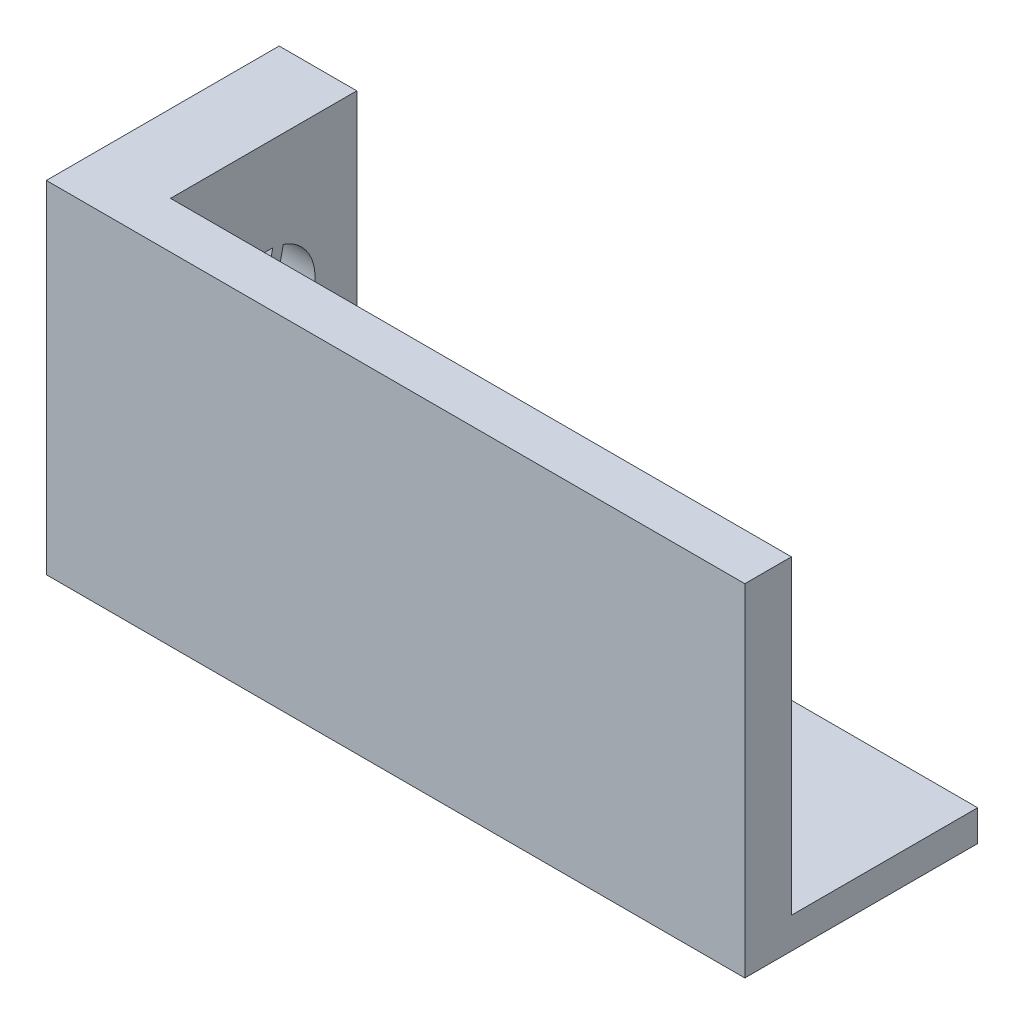
ISO-10303-21;
HEADER;
FILE_DESCRIPTION(('STEP AP214'),'2;1');
FILE_NAME('part.step','',(''),(''),'','','');
FILE_SCHEMA(('AUTOMOTIVE_DESIGN { 1 0 10303 214 1 1 1 1 }'));
ENDSEC;
DATA;
#1=APPLICATION_CONTEXT('core data for automotive mechanical design processes');
#2=APPLICATION_PROTOCOL_DEFINITION('international standard','automotive_design',2000,#1);
#3=PRODUCT_CONTEXT('',#1,'mechanical');
#4=PRODUCT('Part','Part','',(#3));
#5=PRODUCT_RELATED_PRODUCT_CATEGORY('part','',(#4));
#6=PRODUCT_DEFINITION_FORMATION('','',#4);
#7=PRODUCT_DEFINITION_CONTEXT('part definition',#1,'design');
#8=PRODUCT_DEFINITION('design','',#6,#7);
#9=PRODUCT_DEFINITION_SHAPE('','',#8);
#10=(LENGTH_UNIT() NAMED_UNIT(*) SI_UNIT(.MILLI.,.METRE.));
#11=(NAMED_UNIT(*) PLANE_ANGLE_UNIT() SI_UNIT($,.RADIAN.));
#12=(NAMED_UNIT(*) SI_UNIT($,.STERADIAN.) SOLID_ANGLE_UNIT());
#13=UNCERTAINTY_MEASURE_WITH_UNIT(LENGTH_MEASURE(1.E-05),#10,'distance_accuracy_value','');
#14=(GEOMETRIC_REPRESENTATION_CONTEXT(3) GLOBAL_UNCERTAINTY_ASSIGNED_CONTEXT((#13)) GLOBAL_UNIT_ASSIGNED_CONTEXT((#10,
#11,#12)) REPRESENTATION_CONTEXT('',''));
#15=CARTESIAN_POINT('',(0.,0.,0.));
#16=DIRECTION('',(0.,0.,1.));
#17=DIRECTION('',(1.,0.,0.));
#18=AXIS2_PLACEMENT_3D('',#15,#16,#17);
#19=CARTESIAN_POINT('',(-29.6363479611603,5.87776749795377,-6.31155766791802));
#20=DIRECTION('',(1.,0.,0.));
#21=DIRECTION('',(0.,1.,0.));
#22=AXIS2_PLACEMENT_3D('',#19,#20,#21);
#23=CYLINDRICAL_SURFACE('',#22,3.);
#24=CARTESIAN_POINT('',(-16.1510665869218,5.87776749795377,-6.31155766791802));
#25=DIRECTION('',(1.,0.,0.));
#26=DIRECTION('',(0.,1.,0.));
#27=AXIS2_PLACEMENT_3D('',#24,#25,#26);
#28=CIRCLE('',#27,3.);
#29=CARTESIAN_POINT('',(-16.1510665869218,2.89243821302454,-6.01523173158457));
#30=VERTEX_POINT('',#29);
#31=CARTESIAN_POINT('',(-16.1510665869218,8.72177666791811,-7.26634132988484));
#32=VERTEX_POINT('',#31);
#33=EDGE_CURVE('E61',#30,#32,#28,.T.);
#34=ORIENTED_EDGE('',*,*,#33,.T.);
#35=DIRECTION('',(1.,0.,0.));
#36=VECTOR('',#35,1.);
#37=CARTESIAN_POINT('',(-29.6363479611603,8.7217766679181,-7.26634132988484));
#38=LINE('',#37,#36);
#39=CARTESIAN_POINT('',(-21.1510665869218,8.72177666791811,-7.26634132988484));
#40=VERTEX_POINT('',#39);
#41=EDGE_CURVE('E11',#32,#40,#38,.F.);
#42=ORIENTED_EDGE('',*,*,#41,.T.);
#43=CARTESIAN_POINT('',(-21.1510665869218,5.87776749795377,-6.31155766791802));
#44=DIRECTION('',(1.,0.,0.));
#45=DIRECTION('',(0.,1.,0.));
#46=AXIS2_PLACEMENT_3D('',#43,#44,#45);
#47=CIRCLE('',#46,3.);
#48=CARTESIAN_POINT('',(-21.1510665869218,2.89243821302454,-6.01523173158457));
#49=VERTEX_POINT('',#48);
#50=EDGE_CURVE('E121',#40,#49,#47,.F.);
#51=ORIENTED_EDGE('',*,*,#50,.T.);
#52=DIRECTION('',(1.,0.,0.));
#53=VECTOR('',#52,1.);
#54=CARTESIAN_POINT('',(-29.6363479611603,2.89243821302453,-6.01523173158457));
#55=LINE('',#54,#53);
#56=EDGE_CURVE('E47',#49,#30,#55,.T.);
#57=ORIENTED_EDGE('',*,*,#56,.T.);
#58=EDGE_LOOP('',(#34,#42,#51,#57));
#59=FACE_BOUND('',#58,.T.);
#60=ADVANCED_FACE('F39',(#59),#23,.F.);
#61=CARTESIAN_POINT('',(-21.1510665869218,14.9242424242424,3.));
#62=DIRECTION('',(1.,0.,0.));
#63=DIRECTION('',(0.,1.,0.));
#64=AXIS2_PLACEMENT_3D('',#61,#62,#63);
#65=PLANE('',#64);
#66=DIRECTION('',(0.,-0.977734816896052,0.209844294249912));
#67=VECTOR('',#66,1.);
#68=CARTESIAN_POINT('',(-21.1510665869218,2.25234337076596,-5.87785271213513));
#69=LINE('',#68,#67);
#70=EDGE_CURVE('E124',#40,#49,#69,.T.);
#71=ORIENTED_EDGE('',*,*,#70,.T.);
#72=ORIENTED_EDGE('',*,*,#50,.F.);
#73=EDGE_LOOP('',(#71,#72));
#74=FACE_BOUND('',#73,.T.);
#75=DIRECTION('',(0.,0.977734816896052,-0.209844294249912));
#76=VECTOR('',#75,1.);
#77=CARTESIAN_POINT('',(-21.1510665869218,9.04184949505822,-6.61719562011697));
#78=LINE('',#77,#76);
#79=CARTESIAN_POINT('',(-21.1510665869218,3.0429903618736,-5.32970300007908));
#80=VERTEX_POINT('',#79);
#81=CARTESIAN_POINT('',(-21.1510665869218,8.86578623611635,-6.5794084106635));
#82=VERTEX_POINT('',#81);
#83=EDGE_CURVE('E133',#80,#82,#78,.T.);
#84=ORIENTED_EDGE('',*,*,#83,.T.);
#85=EDGE_CURVE('E127',#80,#82,#47,.F.);
#86=ORIENTED_EDGE('',*,*,#85,.F.);
#87=EDGE_LOOP('',(#84,#86));
#88=FACE_BOUND('',#87,.T.);
#89=DIRECTION('',(0.,0.,-1.));
#90=VECTOR('',#89,1.);
#91=CARTESIAN_POINT('',(-21.1510665869218,14.9242424242424,3.));
#92=LINE('',#91,#90);
#93=CARTESIAN_POINT('',(-21.1510665869218,14.9242424242424,3.));
#94=VERTEX_POINT('',#93);
#95=CARTESIAN_POINT('',(-21.1510665869218,14.9242424242424,-12.));
#96=VERTEX_POINT('',#95);
#97=EDGE_CURVE('E183',#94,#96,#92,.T.);
#98=ORIENTED_EDGE('',*,*,#97,.T.);
#99=DIRECTION('',(0.,-1.,0.));
#100=VECTOR('',#99,1.);
#101=CARTESIAN_POINT('',(-21.1510665869218,14.9242424242424,-12.));
#102=LINE('',#101,#100);
#103=CARTESIAN_POINT('',(-21.1510665869218,-7.07575757575758,-12.));
#104=VERTEX_POINT('',#103);
#105=EDGE_CURVE('E163',#96,#104,#102,.T.);
#106=ORIENTED_EDGE('',*,*,#105,.T.);
#107=DIRECTION('',(0.,0.,-1.));
#108=VECTOR('',#107,1.);
#109=CARTESIAN_POINT('',(-21.1510665869218,-7.07575757575758,3.));
#110=LINE('',#109,#108);
#111=CARTESIAN_POINT('',(-21.1510665869218,-7.07575757575758,3.));
#112=VERTEX_POINT('',#111);
#113=EDGE_CURVE('E145',#112,#104,#110,.T.);
#114=ORIENTED_EDGE('',*,*,#113,.F.);
#115=DIRECTION('',(0.,-1.,0.));
#116=VECTOR('',#115,1.);
#117=CARTESIAN_POINT('',(-21.1510665869218,14.9242424242424,3.));
#118=LINE('',#117,#116);
#119=EDGE_CURVE('E176',#94,#112,#118,.T.);
#120=ORIENTED_EDGE('',*,*,#119,.F.);
#121=EDGE_LOOP('',(#98,#106,#114,#120));
#122=FACE_BOUND('',#121,.T.);
#123=ADVANCED_FACE('F41',(#74,#88,#122),#65,.F.);
#124=CARTESIAN_POINT('',(23.8489334130782,14.9242424242424,3.));
#125=DIRECTION('',(-1.,0.,0.));
#126=DIRECTION('',(0.,-1.,0.));
#127=AXIS2_PLACEMENT_3D('',#124,#125,#126);
#128=PLANE('',#127);
#129=DIRECTION('',(0.,1.,0.));
#130=VECTOR('',#129,1.);
#131=CARTESIAN_POINT('',(23.8489334130782,14.9242424242424,0.));
#132=LINE('',#131,#130);
#133=CARTESIAN_POINT('',(23.8489334130782,-5.07575757575758,0.));
#134=VERTEX_POINT('',#133);
#135=CARTESIAN_POINT('',(23.8489334130782,14.9242424242424,0.));
#136=VERTEX_POINT('',#135);
#137=EDGE_CURVE('E186',#134,#136,#132,.T.);
#138=ORIENTED_EDGE('',*,*,#137,.T.);
#139=DIRECTION('',(0.,0.,-1.));
#140=VECTOR('',#139,1.);
#141=CARTESIAN_POINT('',(23.8489334130782,14.9242424242424,3.));
#142=LINE('',#141,#140);
#143=CARTESIAN_POINT('',(23.8489334130782,14.9242424242424,3.));
#144=VERTEX_POINT('',#143);
#145=EDGE_CURVE('E191',#144,#136,#142,.T.);
#146=ORIENTED_EDGE('',*,*,#145,.F.);
#147=DIRECTION('',(0.,1.,0.));
#148=VECTOR('',#147,1.);
#149=CARTESIAN_POINT('',(23.8489334130782,14.9242424242424,3.));
#150=LINE('',#149,#148);
#151=CARTESIAN_POINT('',(23.8489334130782,-7.07575757575758,3.));
#152=VERTEX_POINT('',#151);
#153=EDGE_CURVE('E178',#152,#144,#150,.T.);
#154=ORIENTED_EDGE('',*,*,#153,.F.);
#155=DIRECTION('',(0.,0.,1.));
#156=VECTOR('',#155,1.);
#157=CARTESIAN_POINT('',(23.8489334130782,-7.07575757575758,3.));
#158=LINE('',#157,#156);
#159=CARTESIAN_POINT('',(23.8489334130782,-7.07575757575758,-12.));
#160=VERTEX_POINT('',#159);
#161=EDGE_CURVE('E151',#160,#152,#158,.T.);
#162=ORIENTED_EDGE('',*,*,#161,.F.);
#163=DIRECTION('',(0.,1.,0.));
#164=VECTOR('',#163,1.);
#165=CARTESIAN_POINT('',(23.8489334130782,-7.07575757575758,-12.));
#166=LINE('',#165,#164);
#167=CARTESIAN_POINT('',(23.8489334130782,-5.07575757575758,-12.));
#168=VERTEX_POINT('',#167);
#169=EDGE_CURVE('E157',#160,#168,#166,.T.);
#170=ORIENTED_EDGE('',*,*,#169,.T.);
#171=DIRECTION('',(0.,0.,1.));
#172=VECTOR('',#171,1.);
#173=CARTESIAN_POINT('',(23.8489334130782,-5.07575757575758,3.));
#174=LINE('',#173,#172);
#175=EDGE_CURVE('E149',#168,#134,#174,.T.);
#176=ORIENTED_EDGE('',*,*,#175,.T.);
#177=EDGE_LOOP('',(#138,#146,#154,#162,#170,#176));
#178=FACE_BOUND('',#177,.T.);
#179=ADVANCED_FACE('F225',(#178),#128,.F.);
#180=CARTESIAN_POINT('',(-21.1510665869218,14.9242424242424,3.));
#181=DIRECTION('',(0.,-1.,0.));
#182=DIRECTION('',(0.,0.,-1.));
#183=AXIS2_PLACEMENT_3D('',#180,#181,#182);
#184=PLANE('',#183);
#185=DIRECTION('',(-1.,0.,0.));
#186=VECTOR('',#185,1.);
#187=CARTESIAN_POINT('',(-21.1510665869218,14.9242424242424,0.));
#188=LINE('',#187,#186);
#189=CARTESIAN_POINT('',(-16.1510665869218,14.9242424242424,0.));
#190=VERTEX_POINT('',#189);
#191=EDGE_CURVE('E179',#136,#190,#188,.T.);
#192=ORIENTED_EDGE('',*,*,#191,.T.);
#193=DIRECTION('',(0.,0.,-1.));
#194=VECTOR('',#193,1.);
#195=CARTESIAN_POINT('',(-16.1510665869218,14.9242424242424,3.));
#196=LINE('',#195,#194);
#197=CARTESIAN_POINT('',(-16.1510665869218,14.9242424242424,-12.));
#198=VERTEX_POINT('',#197);
#199=EDGE_CURVE('E164',#190,#198,#196,.T.);
#200=ORIENTED_EDGE('',*,*,#199,.T.);
#201=DIRECTION('',(-1.,0.,0.));
#202=VECTOR('',#201,1.);
#203=CARTESIAN_POINT('',(-16.1510665869218,14.9242424242424,-12.));
#204=LINE('',#203,#202);
#205=EDGE_CURVE('E171',#198,#96,#204,.T.);
#206=ORIENTED_EDGE('',*,*,#205,.T.);
#207=ORIENTED_EDGE('',*,*,#97,.F.);
#208=DIRECTION('',(-1.,0.,0.));
#209=VECTOR('',#208,1.);
#210=CARTESIAN_POINT('',(-21.1510665869218,14.9242424242424,3.));
#211=LINE('',#210,#209);
#212=EDGE_CURVE('E181',#144,#94,#211,.T.);
#213=ORIENTED_EDGE('',*,*,#212,.F.);
#214=ORIENTED_EDGE('',*,*,#145,.T.);
#215=EDGE_LOOP('',(#192,#200,#206,#207,#213,#214));
#216=FACE_BOUND('',#215,.T.);
#217=ADVANCED_FACE('F238',(#216),#184,.F.);
#218=CARTESIAN_POINT('',(0.,0.,3.));
#219=DIRECTION('',(0.,0.,1.));
#220=DIRECTION('',(1.,0.,0.));
#221=AXIS2_PLACEMENT_3D('',#218,#219,#220);
#222=PLANE('',#221);
#223=ORIENTED_EDGE('',*,*,#212,.T.);
#224=ORIENTED_EDGE('',*,*,#119,.T.);
#225=DIRECTION('',(-1.,0.,0.));
#226=VECTOR('',#225,1.);
#227=CARTESIAN_POINT('',(-21.1510665869218,-7.07575757575758,3.));
#228=LINE('',#227,#226);
#229=EDGE_CURVE('E154',#152,#112,#228,.T.);
#230=ORIENTED_EDGE('',*,*,#229,.F.);
#231=ORIENTED_EDGE('',*,*,#153,.T.);
#232=EDGE_LOOP('',(#223,#224,#230,#231));
#233=FACE_BOUND('',#232,.T.);
#234=ADVANCED_FACE('F232',(#233),#222,.T.);
#235=CARTESIAN_POINT('',(0.,0.,0.));
#236=DIRECTION('',(0.,0.,1.));
#237=DIRECTION('',(1.,0.,0.));
#238=AXIS2_PLACEMENT_3D('',#235,#236,#237);
#239=PLANE('',#238);
#240=DIRECTION('',(1.,0.,0.));
#241=VECTOR('',#240,1.);
#242=CARTESIAN_POINT('',(-21.1510665869218,-5.07575757575758,0.));
#243=LINE('',#242,#241);
#244=CARTESIAN_POINT('',(-16.1510665869218,-5.07575757575758,0.));
#245=VERTEX_POINT('',#244);
#246=EDGE_CURVE('E175',#245,#134,#243,.T.);
#247=ORIENTED_EDGE('',*,*,#246,.F.);
#248=DIRECTION('',(0.,1.,0.));
#249=VECTOR('',#248,1.);
#250=CARTESIAN_POINT('',(-16.1510665869218,0.,0.));
#251=LINE('',#250,#249);
#252=EDGE_CURVE('E194',#245,#190,#251,.T.);
#253=ORIENTED_EDGE('',*,*,#252,.T.);
#254=ORIENTED_EDGE('',*,*,#191,.F.);
#255=ORIENTED_EDGE('',*,*,#137,.F.);
#256=EDGE_LOOP('',(#247,#253,#254,#255));
#257=FACE_BOUND('',#256,.T.);
#258=ADVANCED_FACE('F205',(#257),#239,.F.);
#259=CARTESIAN_POINT('',(-16.1510665869218,0.,0.));
#260=DIRECTION('',(1.,0.,0.));
#261=DIRECTION('',(0.,1.,0.));
#262=AXIS2_PLACEMENT_3D('',#259,#260,#261);
#263=PLANE('',#262);
#264=ORIENTED_EDGE('',*,*,#33,.F.);
#265=DIRECTION('',(0.,0.977734816896052,-0.209844294249912));
#266=VECTOR('',#265,1.);
#267=CARTESIAN_POINT('',(-16.1510665869218,2.25234337076596,-5.87785271213513));
#268=LINE('',#267,#266);
#269=EDGE_CURVE('E134',#30,#32,#268,.T.);
#270=ORIENTED_EDGE('',*,*,#269,.T.);
#271=EDGE_LOOP('',(#264,#270));
#272=FACE_BOUND('',#271,.T.);
#273=CARTESIAN_POINT('',(-16.1510665869218,8.86578623611635,-6.5794084106635));
#274=VERTEX_POINT('',#273);
#275=CARTESIAN_POINT('',(-16.1510665869218,3.04299036187361,-5.32970300007908));
#276=VERTEX_POINT('',#275);
#277=EDGE_CURVE('E137',#274,#276,#28,.T.);
#278=ORIENTED_EDGE('',*,*,#277,.F.);
#279=DIRECTION('',(0.,-0.977734816896052,0.209844294249912));
#280=VECTOR('',#279,1.);
#281=CARTESIAN_POINT('',(-16.1510665869218,9.04184949505822,-6.61719562011697));
#282=LINE('',#281,#280);
#283=EDGE_CURVE('E139',#274,#276,#282,.T.);
#284=ORIENTED_EDGE('',*,*,#283,.T.);
#285=EDGE_LOOP('',(#278,#284));
#286=FACE_BOUND('',#285,.T.);
#287=ORIENTED_EDGE('',*,*,#252,.F.);
#288=DIRECTION('',(0.,0.,1.));
#289=VECTOR('',#288,1.);
#290=CARTESIAN_POINT('',(-16.1510665869218,-5.07575757575758,3.));
#291=LINE('',#290,#289);
#292=CARTESIAN_POINT('',(-16.1510665869218,-5.07575757575758,-12.));
#293=VERTEX_POINT('',#292);
#294=EDGE_CURVE('E168',#293,#245,#291,.T.);
#295=ORIENTED_EDGE('',*,*,#294,.F.);
#296=DIRECTION('',(0.,-1.,0.));
#297=VECTOR('',#296,1.);
#298=CARTESIAN_POINT('',(-16.1510665869218,14.9242424242424,-12.));
#299=LINE('',#298,#297);
#300=EDGE_CURVE('E166',#198,#293,#299,.T.);
#301=ORIENTED_EDGE('',*,*,#300,.F.);
#302=ORIENTED_EDGE('',*,*,#199,.F.);
#303=EDGE_LOOP('',(#287,#295,#301,#302));
#304=FACE_BOUND('',#303,.T.);
#305=ADVANCED_FACE('F201',(#272,#286,#304),#263,.T.);
#306=CARTESIAN_POINT('',(-16.1510665869218,14.9242424242424,-12.));
#307=DIRECTION('',(0.,0.,-1.));
#308=DIRECTION('',(0.,1.,0.));
#309=AXIS2_PLACEMENT_3D('',#306,#307,#308);
#310=PLANE('',#309);
#311=ORIENTED_EDGE('',*,*,#105,.F.);
#312=ORIENTED_EDGE('',*,*,#205,.F.);
#313=ORIENTED_EDGE('',*,*,#300,.T.);
#314=DIRECTION('',(1.,0.,0.));
#315=VECTOR('',#314,1.);
#316=CARTESIAN_POINT('',(-21.1510665869218,-5.07575757575758,-12.));
#317=LINE('',#316,#315);
#318=EDGE_CURVE('E126',#293,#168,#317,.T.);
#319=ORIENTED_EDGE('',*,*,#318,.T.);
#320=ORIENTED_EDGE('',*,*,#169,.F.);
#321=DIRECTION('',(1.,0.,0.));
#322=VECTOR('',#321,1.);
#323=CARTESIAN_POINT('',(-21.1510665869218,-7.07575757575758,-12.));
#324=LINE('',#323,#322);
#325=EDGE_CURVE('E148',#104,#160,#324,.T.);
#326=ORIENTED_EDGE('',*,*,#325,.F.);
#327=EDGE_LOOP('',(#311,#312,#313,#319,#320,#326));
#328=FACE_BOUND('',#327,.T.);
#329=ADVANCED_FACE('F204',(#328),#310,.T.);
#330=CARTESIAN_POINT('',(0.,-5.07575757575758,0.));
#331=DIRECTION('',(0.,-1.,0.));
#332=DIRECTION('',(0.,0.,-1.));
#333=AXIS2_PLACEMENT_3D('',#330,#331,#332);
#334=PLANE('',#333);
#335=ORIENTED_EDGE('',*,*,#318,.F.);
#336=ORIENTED_EDGE('',*,*,#294,.T.);
#337=ORIENTED_EDGE('',*,*,#246,.T.);
#338=ORIENTED_EDGE('',*,*,#175,.F.);
#339=EDGE_LOOP('',(#335,#336,#337,#338));
#340=FACE_BOUND('',#339,.T.);
#341=ADVANCED_FACE('F217',(#340),#334,.F.);
#342=CARTESIAN_POINT('',(0.,-7.07575757575758,0.));
#343=DIRECTION('',(0.,-1.,0.));
#344=DIRECTION('',(0.,0.,-1.));
#345=AXIS2_PLACEMENT_3D('',#342,#343,#344);
#346=PLANE('',#345);
#347=ORIENTED_EDGE('',*,*,#113,.T.);
#348=ORIENTED_EDGE('',*,*,#325,.T.);
#349=ORIENTED_EDGE('',*,*,#161,.T.);
#350=ORIENTED_EDGE('',*,*,#229,.T.);
#351=EDGE_LOOP('',(#347,#348,#349,#350));
#352=FACE_BOUND('',#351,.T.);
#353=ADVANCED_FACE('F229',(#352),#346,.T.);
#354=ORIENTED_EDGE('',*,*,#277,.T.);
#355=DIRECTION('',(1.,0.,0.));
#356=VECTOR('',#355,1.);
#357=CARTESIAN_POINT('',(-29.6363479611603,3.0429903618736,-5.32970300007908));
#358=LINE('',#357,#356);
#359=EDGE_CURVE('E198',#276,#80,#358,.F.);
#360=ORIENTED_EDGE('',*,*,#359,.T.);
#361=ORIENTED_EDGE('',*,*,#85,.T.);
#362=DIRECTION('',(1.,0.,0.));
#363=VECTOR('',#362,1.);
#364=CARTESIAN_POINT('',(-29.6363479611603,8.86578623611635,-6.5794084106635));
#365=LINE('',#364,#363);
#366=EDGE_CURVE('E54',#82,#274,#365,.T.);
#367=ORIENTED_EDGE('',*,*,#366,.T.);
#368=EDGE_LOOP('',(#354,#360,#361,#367));
#369=FACE_BOUND('',#368,.T.);
#370=ADVANCED_FACE('F249',(#369),#23,.F.);
#371=CARTESIAN_POINT('',(-28.2708712700378,2.25234337076596,-5.87785271213513));
#372=DIRECTION('',(0.,-0.209844294249912,-0.977734816896052));
#373=DIRECTION('',(0.,0.977734816896052,-0.209844294249912));
#374=AXIS2_PLACEMENT_3D('',#371,#372,#373);
#375=PLANE('',#374);
#376=ORIENTED_EDGE('',*,*,#41,.F.);
#377=ORIENTED_EDGE('',*,*,#269,.F.);
#378=ORIENTED_EDGE('',*,*,#56,.F.);
#379=ORIENTED_EDGE('',*,*,#70,.F.);
#380=EDGE_LOOP('',(#376,#377,#378,#379));
#381=FACE_BOUND('',#380,.T.);
#382=ADVANCED_FACE('F132',(#381),#375,.T.);
#383=CARTESIAN_POINT('',(-28.2708712700378,9.04184949505822,-6.61719562011697));
#384=DIRECTION('',(0.,0.209844294249912,0.977734816896052));
#385=DIRECTION('',(0.,-0.977734816896052,0.209844294249912));
#386=AXIS2_PLACEMENT_3D('',#383,#384,#385);
#387=PLANE('',#386);
#388=ORIENTED_EDGE('',*,*,#359,.F.);
#389=ORIENTED_EDGE('',*,*,#283,.F.);
#390=ORIENTED_EDGE('',*,*,#366,.F.);
#391=ORIENTED_EDGE('',*,*,#83,.F.);
#392=EDGE_LOOP('',(#388,#389,#390,#391));
#393=FACE_BOUND('',#392,.T.);
#394=ADVANCED_FACE('F260',(#393),#387,.T.);
#395=CLOSED_SHELL('',(#60,#123,#179,#217,#234,#258,#305,#329,#341,#353,#370,#382,#394));
#396=MANIFOLD_SOLID_BREP('B2',#395);
#397=ADVANCED_BREP_SHAPE_REPRESENTATION('',(#18,#396),#14);
#398=SHAPE_DEFINITION_REPRESENTATION(#9,#397);
ENDSEC;
END-ISO-10303-21;
